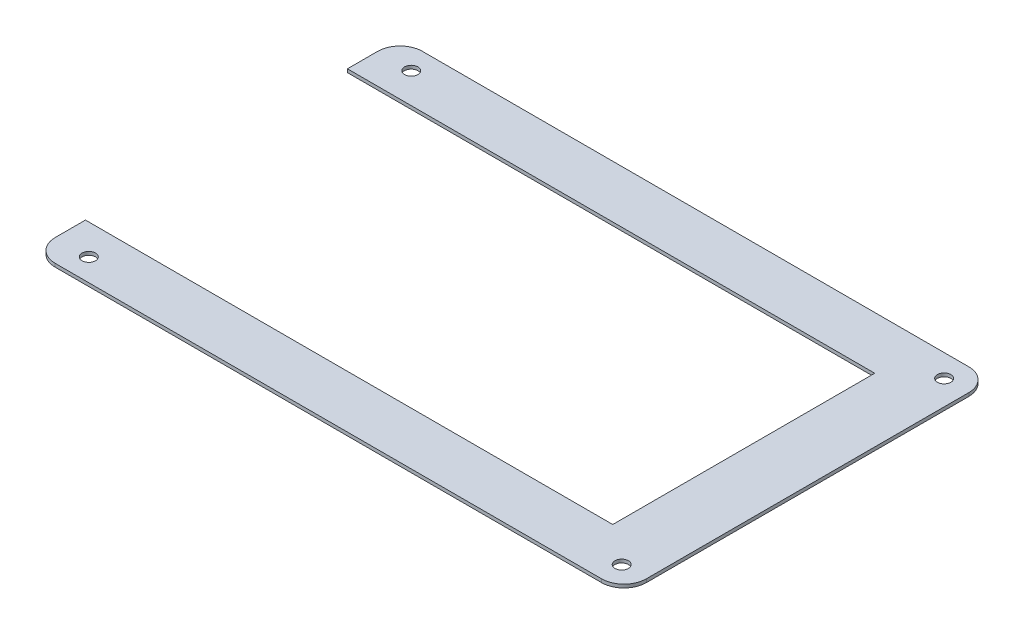
ISO-10303-21;
HEADER;
FILE_DESCRIPTION(('STEP AP214'),'2;1');
FILE_NAME('part.step','',(''),(''),'','','');
FILE_SCHEMA(('AUTOMOTIVE_DESIGN { 1 0 10303 214 1 1 1 1 }'));
ENDSEC;
DATA;
#1=APPLICATION_CONTEXT('core data for automotive mechanical design processes');
#2=APPLICATION_PROTOCOL_DEFINITION('international standard','automotive_design',2000,#1);
#3=PRODUCT_CONTEXT('',#1,'mechanical');
#4=PRODUCT('Part','Part','',(#3));
#5=PRODUCT_RELATED_PRODUCT_CATEGORY('part','',(#4));
#6=PRODUCT_DEFINITION_FORMATION('','',#4);
#7=PRODUCT_DEFINITION_CONTEXT('part definition',#1,'design');
#8=PRODUCT_DEFINITION('design','',#6,#7);
#9=PRODUCT_DEFINITION_SHAPE('','',#8);
#10=(LENGTH_UNIT() NAMED_UNIT(*) SI_UNIT(.MILLI.,.METRE.));
#11=(NAMED_UNIT(*) PLANE_ANGLE_UNIT() SI_UNIT($,.RADIAN.));
#12=(NAMED_UNIT(*) SI_UNIT($,.STERADIAN.) SOLID_ANGLE_UNIT());
#13=UNCERTAINTY_MEASURE_WITH_UNIT(LENGTH_MEASURE(1.E-05),#10,'distance_accuracy_value','');
#14=(GEOMETRIC_REPRESENTATION_CONTEXT(3) GLOBAL_UNCERTAINTY_ASSIGNED_CONTEXT((#13)) GLOBAL_UNIT_ASSIGNED_CONTEXT((#10,
#11,#12)) REPRESENTATION_CONTEXT('',''));
#15=CARTESIAN_POINT('',(0.,0.,0.));
#16=DIRECTION('',(0.,0.,1.));
#17=DIRECTION('',(1.,0.,0.));
#18=AXIS2_PLACEMENT_3D('',#15,#16,#17);
#19=CARTESIAN_POINT('',(-117.20726982068,1.5,72.));
#20=DIRECTION('',(0.,-1.,0.));
#21=DIRECTION('',(0.,0.,-1.));
#22=AXIS2_PLACEMENT_3D('',#19,#20,#21);
#23=PLANE('',#22);
#24=CARTESIAN_POINT('',(-117.20726982068,1.5,72.));
#25=DIRECTION('',(0.,1.,0.));
#26=DIRECTION('',(0.,0.,-1.));
#27=AXIS2_PLACEMENT_3D('',#24,#25,#26);
#28=CIRCLE('',#27,9.99999999999999);
#29=CARTESIAN_POINT('',(-127.20726982068,1.5,72.));
#30=VERTEX_POINT('',#29);
#31=CARTESIAN_POINT('',(-117.20726982068,1.5,82.));
#32=VERTEX_POINT('',#31);
#33=EDGE_CURVE('E183',#30,#32,#28,.T.);
#34=ORIENTED_EDGE('',*,*,#33,.T.);
#35=DIRECTION('',(1.,0.,0.));
#36=VECTOR('',#35,1.);
#37=CARTESIAN_POINT('',(-117.20726982068,1.5,82.));
#38=LINE('',#37,#36);
#39=CARTESIAN_POINT('',(126.79273017932,1.5,82.));
#40=VERTEX_POINT('',#39);
#41=EDGE_CURVE('E111',#32,#40,#38,.T.);
#42=ORIENTED_EDGE('',*,*,#41,.T.);
#43=CARTESIAN_POINT('',(126.79273017932,1.5,72.));
#44=DIRECTION('',(0.,1.,0.));
#45=DIRECTION('',(0.,0.,1.));
#46=AXIS2_PLACEMENT_3D('',#43,#44,#45);
#47=CIRCLE('',#46,10.);
#48=CARTESIAN_POINT('',(136.79273017932,1.5,72.));
#49=VERTEX_POINT('',#48);
#50=EDGE_CURVE('E210',#40,#49,#47,.T.);
#51=ORIENTED_EDGE('',*,*,#50,.T.);
#52=DIRECTION('',(0.,0.,-1.));
#53=VECTOR('',#52,1.);
#54=CARTESIAN_POINT('',(136.79273017932,1.5,72.));
#55=LINE('',#54,#53);
#56=CARTESIAN_POINT('',(136.79273017932,1.5,-72.));
#57=VERTEX_POINT('',#56);
#58=EDGE_CURVE('E229',#49,#57,#55,.T.);
#59=ORIENTED_EDGE('',*,*,#58,.T.);
#60=CARTESIAN_POINT('',(126.79273017932,1.5,-72.));
#61=DIRECTION('',(0.,1.,0.));
#62=DIRECTION('',(0.,0.,1.));
#63=AXIS2_PLACEMENT_3D('',#60,#61,#62);
#64=CIRCLE('',#63,10.);
#65=CARTESIAN_POINT('',(126.79273017932,1.5,-82.));
#66=VERTEX_POINT('',#65);
#67=EDGE_CURVE('E226',#57,#66,#64,.T.);
#68=ORIENTED_EDGE('',*,*,#67,.T.);
#69=DIRECTION('',(-1.,0.,0.));
#70=VECTOR('',#69,1.);
#71=CARTESIAN_POINT('',(-117.20726982068,1.5,-82.));
#72=LINE('',#71,#70);
#73=CARTESIAN_POINT('',(-117.20726982068,1.5,-82.));
#74=VERTEX_POINT('',#73);
#75=EDGE_CURVE('E228',#66,#74,#72,.T.);
#76=ORIENTED_EDGE('',*,*,#75,.T.);
#77=CARTESIAN_POINT('',(-117.20726982068,1.5,-72.));
#78=DIRECTION('',(0.,1.,0.));
#79=DIRECTION('',(0.,0.,1.));
#80=AXIS2_PLACEMENT_3D('',#77,#78,#79);
#81=CIRCLE('',#80,9.99999999999999);
#82=CARTESIAN_POINT('',(-127.20726982068,1.5,-72.));
#83=VERTEX_POINT('',#82);
#84=EDGE_CURVE('E231',#74,#83,#81,.T.);
#85=ORIENTED_EDGE('',*,*,#84,.T.);
#86=DIRECTION('',(0.,0.,1.));
#87=VECTOR('',#86,1.);
#88=CARTESIAN_POINT('',(-127.20726982068,1.5,-58.5));
#89=LINE('',#88,#87);
#90=CARTESIAN_POINT('',(-127.20726982068,1.5,-58.5));
#91=VERTEX_POINT('',#90);
#92=EDGE_CURVE('E237',#83,#91,#89,.T.);
#93=ORIENTED_EDGE('',*,*,#92,.T.);
#94=DIRECTION('',(1.,0.,0.));
#95=VECTOR('',#94,1.);
#96=CARTESIAN_POINT('',(-127.20726982068,1.5,-58.5));
#97=LINE('',#96,#95);
#98=CARTESIAN_POINT('',(108.29273017932,1.5,-58.5));
#99=VERTEX_POINT('',#98);
#100=EDGE_CURVE('E142',#91,#99,#97,.T.);
#101=ORIENTED_EDGE('',*,*,#100,.T.);
#102=DIRECTION('',(0.,0.,1.));
#103=VECTOR('',#102,1.);
#104=CARTESIAN_POINT('',(108.29273017932,1.5,-58.5));
#105=LINE('',#104,#103);
#106=CARTESIAN_POINT('',(108.29273017932,1.5,58.5));
#107=VERTEX_POINT('',#106);
#108=EDGE_CURVE('E136',#99,#107,#105,.T.);
#109=ORIENTED_EDGE('',*,*,#108,.T.);
#110=DIRECTION('',(-1.,0.,0.));
#111=VECTOR('',#110,1.);
#112=CARTESIAN_POINT('',(-127.20726982068,1.5,58.5));
#113=LINE('',#112,#111);
#114=CARTESIAN_POINT('',(-127.20726982068,1.5,58.5));
#115=VERTEX_POINT('',#114);
#116=EDGE_CURVE('E140',#107,#115,#113,.T.);
#117=ORIENTED_EDGE('',*,*,#116,.T.);
#118=DIRECTION('',(0.,0.,1.));
#119=VECTOR('',#118,1.);
#120=CARTESIAN_POINT('',(-127.20726982068,1.5,72.));
#121=LINE('',#120,#119);
#122=EDGE_CURVE('E56',#115,#30,#121,.T.);
#123=ORIENTED_EDGE('',*,*,#122,.T.);
#124=EDGE_LOOP('',(#34,#42,#51,#59,#68,#76,#85,#93,#101,#109,#117,#123));
#125=FACE_BOUND('',#124,.T.);
#126=CARTESIAN_POINT('',(125.79273017932,1.5,-72.));
#127=DIRECTION('',(0.,1.,0.));
#128=DIRECTION('',(0.,0.,1.));
#129=AXIS2_PLACEMENT_3D('',#126,#127,#128);
#130=CIRCLE('',#129,2.99999999999999);
#131=CARTESIAN_POINT('',(125.79273017932,1.5,-69.));
#132=VERTEX_POINT('',#131);
#133=EDGE_CURVE('E164',#132,#132,#130,.T.);
#134=ORIENTED_EDGE('',*,*,#133,.F.);
#135=EDGE_LOOP('',(#134));
#136=FACE_BOUND('',#135,.T.);
#137=CARTESIAN_POINT('',(-112.20726982068,1.5,-72.));
#138=DIRECTION('',(0.,1.,0.));
#139=DIRECTION('',(0.,0.,1.));
#140=AXIS2_PLACEMENT_3D('',#137,#138,#139);
#141=CIRCLE('',#140,3.00000000000001);
#142=CARTESIAN_POINT('',(-112.20726982068,1.5,-69.));
#143=VERTEX_POINT('',#142);
#144=EDGE_CURVE('E301',#143,#143,#141,.T.);
#145=ORIENTED_EDGE('',*,*,#144,.F.);
#146=EDGE_LOOP('',(#145));
#147=FACE_BOUND('',#146,.T.);
#148=CARTESIAN_POINT('',(-112.20726982068,1.5,72.));
#149=DIRECTION('',(0.,1.,0.));
#150=DIRECTION('',(0.,0.,1.));
#151=AXIS2_PLACEMENT_3D('',#148,#149,#150);
#152=CIRCLE('',#151,3.00000000000001);
#153=CARTESIAN_POINT('',(-112.20726982068,1.5,75.));
#154=VERTEX_POINT('',#153);
#155=EDGE_CURVE('E295',#154,#154,#152,.T.);
#156=ORIENTED_EDGE('',*,*,#155,.F.);
#157=EDGE_LOOP('',(#156));
#158=FACE_BOUND('',#157,.T.);
#159=CARTESIAN_POINT('',(125.79273017932,1.5,72.));
#160=DIRECTION('',(0.,1.,0.));
#161=DIRECTION('',(0.,0.,1.));
#162=AXIS2_PLACEMENT_3D('',#159,#160,#161);
#163=CIRCLE('',#162,2.99999999999999);
#164=CARTESIAN_POINT('',(125.79273017932,1.5,75.));
#165=VERTEX_POINT('',#164);
#166=EDGE_CURVE('E286',#165,#165,#163,.T.);
#167=ORIENTED_EDGE('',*,*,#166,.F.);
#168=EDGE_LOOP('',(#167));
#169=FACE_BOUND('',#168,.T.);
#170=ADVANCED_FACE('F39',(#125,#136,#147,#158,#169),#23,.F.);
#171=CARTESIAN_POINT('',(-117.20726982068,0.,72.));
#172=DIRECTION('',(0.,-1.,0.));
#173=DIRECTION('',(0.,0.,-1.));
#174=AXIS2_PLACEMENT_3D('',#171,#172,#173);
#175=PLANE('',#174);
#176=CARTESIAN_POINT('',(-112.20726982068,0.,72.));
#177=DIRECTION('',(0.,1.,0.));
#178=DIRECTION('',(0.,0.,1.));
#179=AXIS2_PLACEMENT_3D('',#176,#177,#178);
#180=CIRCLE('',#179,3.00000000000001);
#181=CARTESIAN_POINT('',(-112.20726982068,0.,75.));
#182=VERTEX_POINT('',#181);
#183=EDGE_CURVE('E292',#182,#182,#180,.T.);
#184=ORIENTED_EDGE('',*,*,#183,.T.);
#185=EDGE_LOOP('',(#184));
#186=FACE_BOUND('',#185,.T.);
#187=CARTESIAN_POINT('',(125.79273017932,0.,-72.));
#188=DIRECTION('',(0.,1.,0.));
#189=DIRECTION('',(0.,0.,1.));
#190=AXIS2_PLACEMENT_3D('',#187,#188,#189);
#191=CIRCLE('',#190,2.99999999999999);
#192=CARTESIAN_POINT('',(125.79273017932,0.,-69.));
#193=VERTEX_POINT('',#192);
#194=EDGE_CURVE('E304',#193,#193,#191,.T.);
#195=ORIENTED_EDGE('',*,*,#194,.T.);
#196=EDGE_LOOP('',(#195));
#197=FACE_BOUND('',#196,.T.);
#198=CARTESIAN_POINT('',(-117.20726982068,0.,72.));
#199=DIRECTION('',(0.,1.,0.));
#200=DIRECTION('',(0.,0.,-1.));
#201=AXIS2_PLACEMENT_3D('',#198,#199,#200);
#202=CIRCLE('',#201,9.99999999999999);
#203=CARTESIAN_POINT('',(-127.20726982068,0.,72.));
#204=VERTEX_POINT('',#203);
#205=CARTESIAN_POINT('',(-117.20726982068,0.,82.));
#206=VERTEX_POINT('',#205);
#207=EDGE_CURVE('E160',#204,#206,#202,.T.);
#208=ORIENTED_EDGE('',*,*,#207,.F.);
#209=DIRECTION('',(0.,0.,1.));
#210=VECTOR('',#209,1.);
#211=CARTESIAN_POINT('',(-127.20726982068,0.,72.));
#212=LINE('',#211,#210);
#213=CARTESIAN_POINT('',(-127.20726982068,0.,58.5));
#214=VERTEX_POINT('',#213);
#215=EDGE_CURVE('E103',#214,#204,#212,.T.);
#216=ORIENTED_EDGE('',*,*,#215,.F.);
#217=DIRECTION('',(-1.,0.,0.));
#218=VECTOR('',#217,1.);
#219=CARTESIAN_POINT('',(-127.20726982068,0.,58.5));
#220=LINE('',#219,#218);
#221=CARTESIAN_POINT('',(108.29273017932,0.,58.5));
#222=VERTEX_POINT('',#221);
#223=EDGE_CURVE('E97',#222,#214,#220,.T.);
#224=ORIENTED_EDGE('',*,*,#223,.F.);
#225=DIRECTION('',(0.,0.,1.));
#226=VECTOR('',#225,1.);
#227=CARTESIAN_POINT('',(108.29273017932,0.,-58.5));
#228=LINE('',#227,#226);
#229=CARTESIAN_POINT('',(108.29273017932,0.,-58.5));
#230=VERTEX_POINT('',#229);
#231=EDGE_CURVE('E150',#230,#222,#228,.T.);
#232=ORIENTED_EDGE('',*,*,#231,.F.);
#233=DIRECTION('',(1.,0.,0.));
#234=VECTOR('',#233,1.);
#235=CARTESIAN_POINT('',(-127.20726982068,0.,-58.5));
#236=LINE('',#235,#234);
#237=CARTESIAN_POINT('',(-127.20726982068,0.,-58.5));
#238=VERTEX_POINT('',#237);
#239=EDGE_CURVE('E178',#238,#230,#236,.T.);
#240=ORIENTED_EDGE('',*,*,#239,.F.);
#241=DIRECTION('',(0.,0.,1.));
#242=VECTOR('',#241,1.);
#243=CARTESIAN_POINT('',(-127.20726982068,0.,-58.5));
#244=LINE('',#243,#242);
#245=CARTESIAN_POINT('',(-127.20726982068,0.,-72.));
#246=VERTEX_POINT('',#245);
#247=EDGE_CURVE('E176',#246,#238,#244,.T.);
#248=ORIENTED_EDGE('',*,*,#247,.F.);
#249=CARTESIAN_POINT('',(-117.20726982068,0.,-72.));
#250=DIRECTION('',(0.,1.,0.));
#251=DIRECTION('',(0.,0.,1.));
#252=AXIS2_PLACEMENT_3D('',#249,#250,#251);
#253=CIRCLE('',#252,9.99999999999999);
#254=CARTESIAN_POINT('',(-117.20726982068,0.,-82.));
#255=VERTEX_POINT('',#254);
#256=EDGE_CURVE('E174',#255,#246,#253,.T.);
#257=ORIENTED_EDGE('',*,*,#256,.F.);
#258=DIRECTION('',(-1.,0.,0.));
#259=VECTOR('',#258,1.);
#260=CARTESIAN_POINT('',(-117.20726982068,0.,-82.));
#261=LINE('',#260,#259);
#262=CARTESIAN_POINT('',(126.79273017932,0.,-82.));
#263=VERTEX_POINT('',#262);
#264=EDGE_CURVE('E172',#263,#255,#261,.T.);
#265=ORIENTED_EDGE('',*,*,#264,.F.);
#266=CARTESIAN_POINT('',(126.79273017932,0.,-72.));
#267=DIRECTION('',(0.,1.,0.));
#268=DIRECTION('',(0.,0.,1.));
#269=AXIS2_PLACEMENT_3D('',#266,#267,#268);
#270=CIRCLE('',#269,10.);
#271=CARTESIAN_POINT('',(136.79273017932,0.,-72.));
#272=VERTEX_POINT('',#271);
#273=EDGE_CURVE('E170',#272,#263,#270,.T.);
#274=ORIENTED_EDGE('',*,*,#273,.F.);
#275=DIRECTION('',(0.,0.,-1.));
#276=VECTOR('',#275,1.);
#277=CARTESIAN_POINT('',(136.79273017932,0.,72.));
#278=LINE('',#277,#276);
#279=CARTESIAN_POINT('',(136.79273017932,0.,72.));
#280=VERTEX_POINT('',#279);
#281=EDGE_CURVE('E168',#280,#272,#278,.T.);
#282=ORIENTED_EDGE('',*,*,#281,.F.);
#283=CARTESIAN_POINT('',(126.79273017932,0.,72.));
#284=DIRECTION('',(0.,1.,0.));
#285=DIRECTION('',(0.,0.,1.));
#286=AXIS2_PLACEMENT_3D('',#283,#284,#285);
#287=CIRCLE('',#286,10.);
#288=CARTESIAN_POINT('',(126.79273017932,0.,82.));
#289=VERTEX_POINT('',#288);
#290=EDGE_CURVE('E166',#289,#280,#287,.T.);
#291=ORIENTED_EDGE('',*,*,#290,.F.);
#292=DIRECTION('',(1.,0.,0.));
#293=VECTOR('',#292,1.);
#294=CARTESIAN_POINT('',(-117.20726982068,0.,82.));
#295=LINE('',#294,#293);
#296=EDGE_CURVE('E163',#206,#289,#295,.T.);
#297=ORIENTED_EDGE('',*,*,#296,.F.);
#298=EDGE_LOOP('',(#208,#216,#224,#232,#240,#248,#257,#265,#274,#282,#291,#297));
#299=FACE_BOUND('',#298,.T.);
#300=CARTESIAN_POINT('',(-112.20726982068,0.,-72.));
#301=DIRECTION('',(0.,1.,0.));
#302=DIRECTION('',(0.,0.,1.));
#303=AXIS2_PLACEMENT_3D('',#300,#301,#302);
#304=CIRCLE('',#303,3.00000000000001);
#305=CARTESIAN_POINT('',(-112.20726982068,0.,-69.));
#306=VERTEX_POINT('',#305);
#307=EDGE_CURVE('E298',#306,#306,#304,.T.);
#308=ORIENTED_EDGE('',*,*,#307,.T.);
#309=EDGE_LOOP('',(#308));
#310=FACE_BOUND('',#309,.T.);
#311=CARTESIAN_POINT('',(125.79273017932,0.,72.));
#312=DIRECTION('',(0.,1.,0.));
#313=DIRECTION('',(0.,0.,1.));
#314=AXIS2_PLACEMENT_3D('',#311,#312,#313);
#315=CIRCLE('',#314,2.99999999999999);
#316=CARTESIAN_POINT('',(125.79273017932,0.,75.));
#317=VERTEX_POINT('',#316);
#318=EDGE_CURVE('E289',#317,#317,#315,.T.);
#319=ORIENTED_EDGE('',*,*,#318,.T.);
#320=EDGE_LOOP('',(#319));
#321=FACE_BOUND('',#320,.T.);
#322=ADVANCED_FACE('F214',(#186,#197,#299,#310,#321),#175,.T.);
#323=CARTESIAN_POINT('',(-117.20726982068,1.5,72.));
#324=DIRECTION('',(0.,-1.,0.));
#325=DIRECTION('',(0.,0.,-1.));
#326=AXIS2_PLACEMENT_3D('',#323,#324,#325);
#327=CYLINDRICAL_SURFACE('',#326,9.99999999999999);
#328=ORIENTED_EDGE('',*,*,#207,.T.);
#329=DIRECTION('',(0.,-1.,0.));
#330=VECTOR('',#329,1.);
#331=CARTESIAN_POINT('',(-117.20726982068,1.5,82.));
#332=LINE('',#331,#330);
#333=EDGE_CURVE('E11',#32,#206,#332,.T.);
#334=ORIENTED_EDGE('',*,*,#333,.F.);
#335=ORIENTED_EDGE('',*,*,#33,.F.);
#336=DIRECTION('',(0.,-1.,0.));
#337=VECTOR('',#336,1.);
#338=CARTESIAN_POINT('',(-127.20726982068,1.5,72.));
#339=LINE('',#338,#337);
#340=EDGE_CURVE('E156',#30,#204,#339,.T.);
#341=ORIENTED_EDGE('',*,*,#340,.T.);
#342=EDGE_LOOP('',(#328,#334,#335,#341));
#343=FACE_BOUND('',#342,.T.);
#344=ADVANCED_FACE('F41',(#343),#327,.T.);
#345=CARTESIAN_POINT('',(-117.20726982068,1.5,82.));
#346=DIRECTION('',(0.,0.,-1.));
#347=DIRECTION('',(-1.,0.,0.));
#348=AXIS2_PLACEMENT_3D('',#345,#346,#347);
#349=PLANE('',#348);
#350=ORIENTED_EDGE('',*,*,#296,.T.);
#351=DIRECTION('',(0.,-1.,0.));
#352=VECTOR('',#351,1.);
#353=CARTESIAN_POINT('',(126.79273017932,1.5,82.));
#354=LINE('',#353,#352);
#355=EDGE_CURVE('E48',#40,#289,#354,.T.);
#356=ORIENTED_EDGE('',*,*,#355,.F.);
#357=ORIENTED_EDGE('',*,*,#41,.F.);
#358=ORIENTED_EDGE('',*,*,#333,.T.);
#359=EDGE_LOOP('',(#350,#356,#357,#358));
#360=FACE_BOUND('',#359,.T.);
#361=ADVANCED_FACE('F426',(#360),#349,.F.);
#362=CARTESIAN_POINT('',(126.79273017932,1.5,72.));
#363=DIRECTION('',(0.,-1.,0.));
#364=DIRECTION('',(0.,0.,-1.));
#365=AXIS2_PLACEMENT_3D('',#362,#363,#364);
#366=CYLINDRICAL_SURFACE('',#365,10.);
#367=ORIENTED_EDGE('',*,*,#290,.T.);
#368=DIRECTION('',(0.,-1.,0.));
#369=VECTOR('',#368,1.);
#370=CARTESIAN_POINT('',(136.79273017932,1.5,72.));
#371=LINE('',#370,#369);
#372=EDGE_CURVE('E202',#49,#280,#371,.T.);
#373=ORIENTED_EDGE('',*,*,#372,.F.);
#374=ORIENTED_EDGE('',*,*,#50,.F.);
#375=ORIENTED_EDGE('',*,*,#355,.T.);
#376=EDGE_LOOP('',(#367,#373,#374,#375));
#377=FACE_BOUND('',#376,.T.);
#378=ADVANCED_FACE('F208',(#377),#366,.T.);
#379=CARTESIAN_POINT('',(136.79273017932,1.5,72.));
#380=DIRECTION('',(-1.,0.,0.));
#381=DIRECTION('',(0.,0.,1.));
#382=AXIS2_PLACEMENT_3D('',#379,#380,#381);
#383=PLANE('',#382);
#384=ORIENTED_EDGE('',*,*,#281,.T.);
#385=DIRECTION('',(0.,-1.,0.));
#386=VECTOR('',#385,1.);
#387=CARTESIAN_POINT('',(136.79273017932,1.5,-72.));
#388=LINE('',#387,#386);
#389=EDGE_CURVE('E199',#57,#272,#388,.T.);
#390=ORIENTED_EDGE('',*,*,#389,.F.);
#391=ORIENTED_EDGE('',*,*,#58,.F.);
#392=ORIENTED_EDGE('',*,*,#372,.T.);
#393=EDGE_LOOP('',(#384,#390,#391,#392));
#394=FACE_BOUND('',#393,.T.);
#395=ADVANCED_FACE('F220',(#394),#383,.F.);
#396=CARTESIAN_POINT('',(126.79273017932,1.5,-72.));
#397=DIRECTION('',(0.,-1.,0.));
#398=DIRECTION('',(0.,0.,-1.));
#399=AXIS2_PLACEMENT_3D('',#396,#397,#398);
#400=CYLINDRICAL_SURFACE('',#399,10.);
#401=ORIENTED_EDGE('',*,*,#273,.T.);
#402=DIRECTION('',(0.,-1.,0.));
#403=VECTOR('',#402,1.);
#404=CARTESIAN_POINT('',(126.79273017932,1.5,-82.));
#405=LINE('',#404,#403);
#406=EDGE_CURVE('E196',#66,#263,#405,.T.);
#407=ORIENTED_EDGE('',*,*,#406,.F.);
#408=ORIENTED_EDGE('',*,*,#67,.F.);
#409=ORIENTED_EDGE('',*,*,#389,.T.);
#410=EDGE_LOOP('',(#401,#407,#408,#409));
#411=FACE_BOUND('',#410,.T.);
#412=ADVANCED_FACE('F224',(#411),#400,.T.);
#413=CARTESIAN_POINT('',(-117.20726982068,1.5,-82.));
#414=DIRECTION('',(0.,0.,1.));
#415=DIRECTION('',(1.,0.,0.));
#416=AXIS2_PLACEMENT_3D('',#413,#414,#415);
#417=PLANE('',#416);
#418=ORIENTED_EDGE('',*,*,#264,.T.);
#419=DIRECTION('',(0.,-1.,0.));
#420=VECTOR('',#419,1.);
#421=CARTESIAN_POINT('',(-117.20726982068,1.5,-82.));
#422=LINE('',#421,#420);
#423=EDGE_CURVE('E193',#74,#255,#422,.T.);
#424=ORIENTED_EDGE('',*,*,#423,.F.);
#425=ORIENTED_EDGE('',*,*,#75,.F.);
#426=ORIENTED_EDGE('',*,*,#406,.T.);
#427=EDGE_LOOP('',(#418,#424,#425,#426));
#428=FACE_BOUND('',#427,.T.);
#429=ADVANCED_FACE('F387',(#428),#417,.F.);
#430=CARTESIAN_POINT('',(-117.20726982068,1.5,-72.));
#431=DIRECTION('',(0.,-1.,0.));
#432=DIRECTION('',(0.,0.,-1.));
#433=AXIS2_PLACEMENT_3D('',#430,#431,#432);
#434=CYLINDRICAL_SURFACE('',#433,9.99999999999999);
#435=ORIENTED_EDGE('',*,*,#256,.T.);
#436=DIRECTION('',(0.,-1.,0.));
#437=VECTOR('',#436,1.);
#438=CARTESIAN_POINT('',(-127.20726982068,1.5,-72.));
#439=LINE('',#438,#437);
#440=EDGE_CURVE('E190',#83,#246,#439,.T.);
#441=ORIENTED_EDGE('',*,*,#440,.F.);
#442=ORIENTED_EDGE('',*,*,#84,.F.);
#443=ORIENTED_EDGE('',*,*,#423,.T.);
#444=EDGE_LOOP('',(#435,#441,#442,#443));
#445=FACE_BOUND('',#444,.T.);
#446=ADVANCED_FACE('F377',(#445),#434,.T.);
#447=CARTESIAN_POINT('',(-127.20726982068,1.5,-58.5));
#448=DIRECTION('',(1.,0.,0.));
#449=DIRECTION('',(0.,0.,-1.));
#450=AXIS2_PLACEMENT_3D('',#447,#448,#449);
#451=PLANE('',#450);
#452=ORIENTED_EDGE('',*,*,#247,.T.);
#453=DIRECTION('',(0.,-1.,0.));
#454=VECTOR('',#453,1.);
#455=CARTESIAN_POINT('',(-127.20726982068,1.5,-58.5));
#456=LINE('',#455,#454);
#457=EDGE_CURVE('E187',#91,#238,#456,.T.);
#458=ORIENTED_EDGE('',*,*,#457,.F.);
#459=ORIENTED_EDGE('',*,*,#92,.F.);
#460=ORIENTED_EDGE('',*,*,#440,.T.);
#461=EDGE_LOOP('',(#452,#458,#459,#460));
#462=FACE_BOUND('',#461,.T.);
#463=ADVANCED_FACE('F243',(#462),#451,.F.);
#464=CARTESIAN_POINT('',(-127.20726982068,1.5,-58.5));
#465=DIRECTION('',(0.,0.,-1.));
#466=DIRECTION('',(-1.,0.,0.));
#467=AXIS2_PLACEMENT_3D('',#464,#465,#466);
#468=PLANE('',#467);
#469=ORIENTED_EDGE('',*,*,#239,.T.);
#470=DIRECTION('',(0.,-1.,0.));
#471=VECTOR('',#470,1.);
#472=CARTESIAN_POINT('',(108.29273017932,1.5,-58.5));
#473=LINE('',#472,#471);
#474=EDGE_CURVE('E151',#99,#230,#473,.T.);
#475=ORIENTED_EDGE('',*,*,#474,.F.);
#476=ORIENTED_EDGE('',*,*,#100,.F.);
#477=ORIENTED_EDGE('',*,*,#457,.T.);
#478=EDGE_LOOP('',(#469,#475,#476,#477));
#479=FACE_BOUND('',#478,.T.);
#480=ADVANCED_FACE('F247',(#479),#468,.F.);
#481=CARTESIAN_POINT('',(108.29273017932,1.5,-58.5));
#482=DIRECTION('',(1.,0.,0.));
#483=DIRECTION('',(0.,0.,-1.));
#484=AXIS2_PLACEMENT_3D('',#481,#482,#483);
#485=PLANE('',#484);
#486=ORIENTED_EDGE('',*,*,#231,.T.);
#487=DIRECTION('',(0.,-1.,0.));
#488=VECTOR('',#487,1.);
#489=CARTESIAN_POINT('',(108.29273017932,1.5,58.5));
#490=LINE('',#489,#488);
#491=EDGE_CURVE('E147',#107,#222,#490,.T.);
#492=ORIENTED_EDGE('',*,*,#491,.F.);
#493=ORIENTED_EDGE('',*,*,#108,.F.);
#494=ORIENTED_EDGE('',*,*,#474,.T.);
#495=EDGE_LOOP('',(#486,#492,#493,#494));
#496=FACE_BOUND('',#495,.T.);
#497=ADVANCED_FACE('F148',(#496),#485,.F.);
#498=CARTESIAN_POINT('',(-127.20726982068,1.5,58.5));
#499=DIRECTION('',(0.,0.,1.));
#500=DIRECTION('',(1.,0.,0.));
#501=AXIS2_PLACEMENT_3D('',#498,#499,#500);
#502=PLANE('',#501);
#503=ORIENTED_EDGE('',*,*,#223,.T.);
#504=DIRECTION('',(0.,-1.,0.));
#505=VECTOR('',#504,1.);
#506=CARTESIAN_POINT('',(-127.20726982068,1.5,58.5));
#507=LINE('',#506,#505);
#508=EDGE_CURVE('E152',#115,#214,#507,.T.);
#509=ORIENTED_EDGE('',*,*,#508,.F.);
#510=ORIENTED_EDGE('',*,*,#116,.F.);
#511=ORIENTED_EDGE('',*,*,#491,.T.);
#512=EDGE_LOOP('',(#503,#509,#510,#511));
#513=FACE_BOUND('',#512,.T.);
#514=ADVANCED_FACE('F154',(#513),#502,.F.);
#515=CARTESIAN_POINT('',(-127.20726982068,1.5,72.));
#516=DIRECTION('',(1.,0.,0.));
#517=DIRECTION('',(0.,0.,-1.));
#518=AXIS2_PLACEMENT_3D('',#515,#516,#517);
#519=PLANE('',#518);
#520=ORIENTED_EDGE('',*,*,#215,.T.);
#521=ORIENTED_EDGE('',*,*,#340,.F.);
#522=ORIENTED_EDGE('',*,*,#122,.F.);
#523=ORIENTED_EDGE('',*,*,#508,.T.);
#524=EDGE_LOOP('',(#520,#521,#522,#523));
#525=FACE_BOUND('',#524,.T.);
#526=ADVANCED_FACE('F251',(#525),#519,.F.);
#527=CARTESIAN_POINT('',(125.79273017932,1.5,-72.));
#528=DIRECTION('',(0.,-1.,0.));
#529=DIRECTION('',(0.,0.,-1.));
#530=AXIS2_PLACEMENT_3D('',#527,#528,#529);
#531=CYLINDRICAL_SURFACE('',#530,2.99999999999999);
#532=ORIENTED_EDGE('',*,*,#133,.T.);
#533=EDGE_LOOP('',(#532));
#534=FACE_BOUND('',#533,.T.);
#535=ORIENTED_EDGE('',*,*,#194,.F.);
#536=EDGE_LOOP('',(#535));
#537=FACE_BOUND('',#536,.T.);
#538=ADVANCED_FACE('F253',(#534,#537),#531,.F.);
#539=CARTESIAN_POINT('',(-112.20726982068,1.5,-72.));
#540=DIRECTION('',(0.,-1.,0.));
#541=DIRECTION('',(0.,0.,-1.));
#542=AXIS2_PLACEMENT_3D('',#539,#540,#541);
#543=CYLINDRICAL_SURFACE('',#542,3.00000000000001);
#544=ORIENTED_EDGE('',*,*,#144,.T.);
#545=EDGE_LOOP('',(#544));
#546=FACE_BOUND('',#545,.T.);
#547=ORIENTED_EDGE('',*,*,#307,.F.);
#548=EDGE_LOOP('',(#547));
#549=FACE_BOUND('',#548,.T.);
#550=ADVANCED_FACE('F259',(#546,#549),#543,.F.);
#551=CARTESIAN_POINT('',(-112.20726982068,1.5,72.));
#552=DIRECTION('',(0.,-1.,0.));
#553=DIRECTION('',(0.,0.,-1.));
#554=AXIS2_PLACEMENT_3D('',#551,#552,#553);
#555=CYLINDRICAL_SURFACE('',#554,3.00000000000001);
#556=ORIENTED_EDGE('',*,*,#155,.T.);
#557=EDGE_LOOP('',(#556));
#558=FACE_BOUND('',#557,.T.);
#559=ORIENTED_EDGE('',*,*,#183,.F.);
#560=EDGE_LOOP('',(#559));
#561=FACE_BOUND('',#560,.T.);
#562=ADVANCED_FACE('F273',(#558,#561),#555,.F.);
#563=CARTESIAN_POINT('',(125.79273017932,1.5,72.));
#564=DIRECTION('',(0.,-1.,0.));
#565=DIRECTION('',(0.,0.,-1.));
#566=AXIS2_PLACEMENT_3D('',#563,#564,#565);
#567=CYLINDRICAL_SURFACE('',#566,2.99999999999999);
#568=ORIENTED_EDGE('',*,*,#166,.T.);
#569=EDGE_LOOP('',(#568));
#570=FACE_BOUND('',#569,.T.);
#571=ORIENTED_EDGE('',*,*,#318,.F.);
#572=EDGE_LOOP('',(#571));
#573=FACE_BOUND('',#572,.T.);
#574=ADVANCED_FACE('F277',(#570,#573),#567,.F.);
#575=CLOSED_SHELL('',(#170,#322,#344,#361,#378,#395,#412,#429,#446,#463,#480,#497,#514,#526,
#538,#550,#562,#574));
#576=MANIFOLD_SOLID_BREP('B2',#575);
#577=ADVANCED_BREP_SHAPE_REPRESENTATION('',(#18,#576),#14);
#578=SHAPE_DEFINITION_REPRESENTATION(#9,#577);
ENDSEC;
END-ISO-10303-21;
